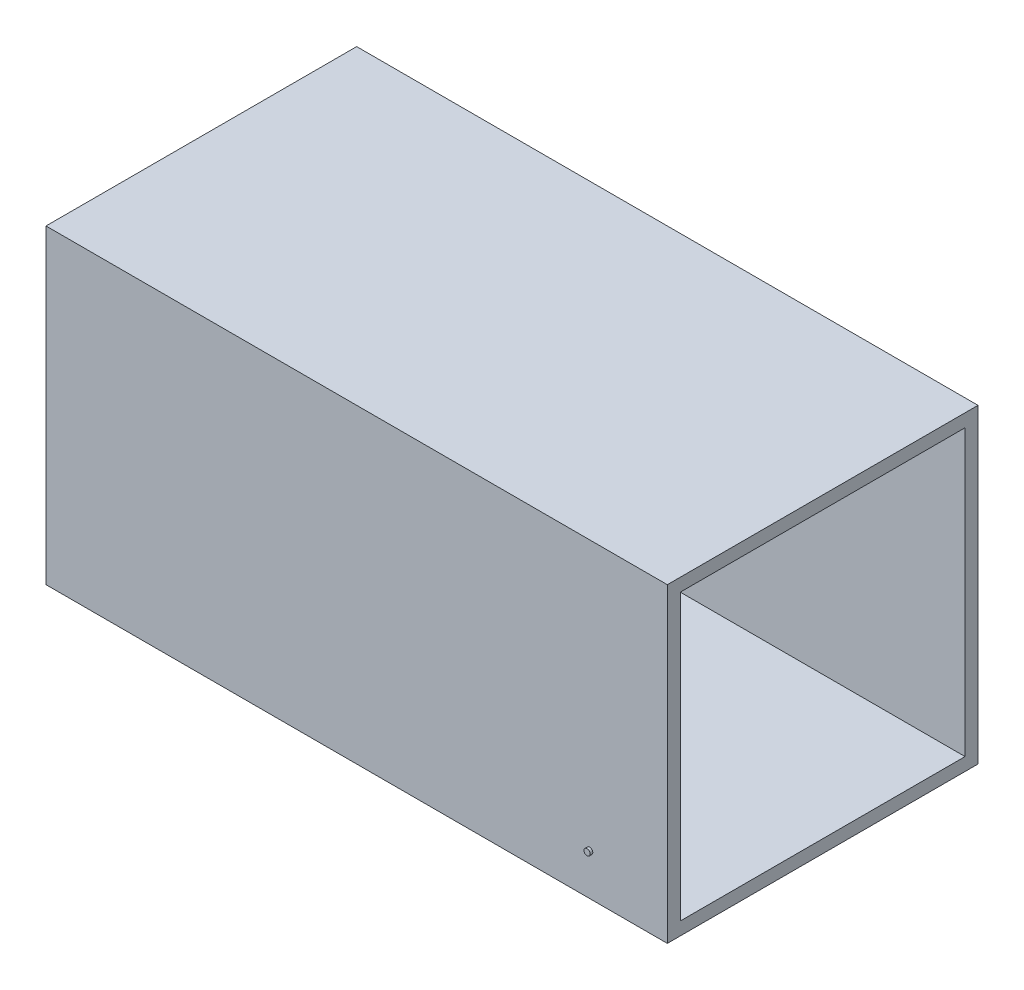
ISO-10303-21;
HEADER;
FILE_DESCRIPTION(('STEP AP214'),'2;1');
FILE_NAME('part.step','',(''),(''),'','','');
FILE_SCHEMA(('AUTOMOTIVE_DESIGN { 1 0 10303 214 1 1 1 1 }'));
ENDSEC;
DATA;
#1=APPLICATION_CONTEXT('core data for automotive mechanical design processes');
#2=APPLICATION_PROTOCOL_DEFINITION('international standard','automotive_design',2000,#1);
#3=PRODUCT_CONTEXT('',#1,'mechanical');
#4=PRODUCT('Part','Part','',(#3));
#5=PRODUCT_RELATED_PRODUCT_CATEGORY('part','',(#4));
#6=PRODUCT_DEFINITION_FORMATION('','',#4);
#7=PRODUCT_DEFINITION_CONTEXT('part definition',#1,'design');
#8=PRODUCT_DEFINITION('design','',#6,#7);
#9=PRODUCT_DEFINITION_SHAPE('','',#8);
#10=(LENGTH_UNIT() NAMED_UNIT(*) SI_UNIT(.MILLI.,.METRE.));
#11=(NAMED_UNIT(*) PLANE_ANGLE_UNIT() SI_UNIT($,.RADIAN.));
#12=(NAMED_UNIT(*) SI_UNIT($,.STERADIAN.) SOLID_ANGLE_UNIT());
#13=UNCERTAINTY_MEASURE_WITH_UNIT(LENGTH_MEASURE(1.E-05),#10,'distance_accuracy_value','');
#14=(GEOMETRIC_REPRESENTATION_CONTEXT(3) GLOBAL_UNCERTAINTY_ASSIGNED_CONTEXT((#13)) GLOBAL_UNIT_ASSIGNED_CONTEXT((#10,
#11,#12)) REPRESENTATION_CONTEXT('',''));
#15=CARTESIAN_POINT('',(0.,0.,0.));
#16=DIRECTION('',(0.,0.,1.));
#17=DIRECTION('',(1.,0.,0.));
#18=AXIS2_PLACEMENT_3D('',#15,#16,#17);
#19=CARTESIAN_POINT('',(1200.,0.,0.));
#20=DIRECTION('',(0.,0.,-1.));
#21=DIRECTION('',(-1.,0.,0.));
#22=AXIS2_PLACEMENT_3D('',#19,#20,#21);
#23=PLANE('',#22);
#24=DIRECTION('',(0.,-1.,0.));
#25=VECTOR('',#24,1.);
#26=CARTESIAN_POINT('',(0.,0.,0.));
#27=LINE('',#26,#25);
#28=CARTESIAN_POINT('',(0.,600.,0.));
#29=VERTEX_POINT('',#28);
#30=CARTESIAN_POINT('',(0.,0.,0.));
#31=VERTEX_POINT('',#30);
#32=EDGE_CURVE('E165',#29,#31,#27,.T.);
#33=ORIENTED_EDGE('',*,*,#32,.T.);
#34=DIRECTION('',(-1.,0.,0.));
#35=VECTOR('',#34,1.);
#36=CARTESIAN_POINT('',(1200.,0.,0.));
#37=LINE('',#36,#35);
#38=CARTESIAN_POINT('',(1200.,0.,0.));
#39=VERTEX_POINT('',#38);
#40=EDGE_CURVE('E46',#39,#31,#37,.T.);
#41=ORIENTED_EDGE('',*,*,#40,.F.);
#42=DIRECTION('',(0.,-1.,0.));
#43=VECTOR('',#42,1.);
#44=CARTESIAN_POINT('',(1200.,0.,0.));
#45=LINE('',#44,#43);
#46=CARTESIAN_POINT('',(1200.,600.,0.));
#47=VERTEX_POINT('',#46);
#48=EDGE_CURVE('E155',#47,#39,#45,.T.);
#49=ORIENTED_EDGE('',*,*,#48,.F.);
#50=DIRECTION('',(-1.,0.,0.));
#51=VECTOR('',#50,1.);
#52=CARTESIAN_POINT('',(1200.,600.,0.));
#53=LINE('',#52,#51);
#54=EDGE_CURVE('E164',#47,#29,#53,.T.);
#55=ORIENTED_EDGE('',*,*,#54,.T.);
#56=EDGE_LOOP('',(#33,#41,#49,#55));
#57=FACE_BOUND('',#56,.T.);
#58=CARTESIAN_POINT('',(1050.,80.,0.));
#59=DIRECTION('',(0.,0.,-1.));
#60=DIRECTION('',(-1.,0.,0.));
#61=AXIS2_PLACEMENT_3D('',#58,#59,#60);
#62=CIRCLE('',#61,6.0000000000001);
#63=CARTESIAN_POINT('',(1044.,80.,0.));
#64=VERTEX_POINT('',#63);
#65=EDGE_CURVE('E11',#64,#64,#62,.F.);
#66=ORIENTED_EDGE('',*,*,#65,.F.);
#67=EDGE_LOOP('',(#66));
#68=FACE_BOUND('',#67,.T.);
#69=ADVANCED_FACE('F39',(#57,#68),#23,.F.);
#70=CARTESIAN_POINT('',(1200.,600.,0.));
#71=DIRECTION('',(-1.,0.,0.));
#72=DIRECTION('',(0.,0.,1.));
#73=AXIS2_PLACEMENT_3D('',#70,#71,#72);
#74=PLANE('',#73);
#75=ORIENTED_EDGE('',*,*,#48,.T.);
#76=DIRECTION('',(0.,0.,-1.));
#77=VECTOR('',#76,1.);
#78=CARTESIAN_POINT('',(1200.,0.,0.));
#79=LINE('',#78,#77);
#80=CARTESIAN_POINT('',(1200.,0.,-600.));
#81=VERTEX_POINT('',#80);
#82=EDGE_CURVE('E91',#39,#81,#79,.T.);
#83=ORIENTED_EDGE('',*,*,#82,.T.);
#84=DIRECTION('',(0.,1.,0.));
#85=VECTOR('',#84,1.);
#86=CARTESIAN_POINT('',(1200.,0.,-600.));
#87=LINE('',#86,#85);
#88=CARTESIAN_POINT('',(1200.,600.,-600.));
#89=VERTEX_POINT('',#88);
#90=EDGE_CURVE('E160',#81,#89,#87,.T.);
#91=ORIENTED_EDGE('',*,*,#90,.T.);
#92=DIRECTION('',(0.,0.,1.));
#93=VECTOR('',#92,1.);
#94=CARTESIAN_POINT('',(1200.,600.,0.));
#95=LINE('',#94,#93);
#96=EDGE_CURVE('E62',#89,#47,#95,.T.);
#97=ORIENTED_EDGE('',*,*,#96,.T.);
#98=EDGE_LOOP('',(#75,#83,#91,#97));
#99=FACE_BOUND('',#98,.T.);
#100=DIRECTION('',(0.,-1.,0.));
#101=VECTOR('',#100,1.);
#102=CARTESIAN_POINT('',(1200.,600.,-25.));
#103=LINE('',#102,#101);
#104=CARTESIAN_POINT('',(1200.,575.,-25.));
#105=VERTEX_POINT('',#104);
#106=CARTESIAN_POINT('',(1200.,25.,-25.));
#107=VERTEX_POINT('',#106);
#108=EDGE_CURVE('E141',#105,#107,#103,.T.);
#109=ORIENTED_EDGE('',*,*,#108,.F.);
#110=DIRECTION('',(0.,0.,1.));
#111=VECTOR('',#110,1.);
#112=CARTESIAN_POINT('',(1200.,575.,0.));
#113=LINE('',#112,#111);
#114=CARTESIAN_POINT('',(1200.,575.,-575.));
#115=VERTEX_POINT('',#114);
#116=EDGE_CURVE('E153',#115,#105,#113,.T.);
#117=ORIENTED_EDGE('',*,*,#116,.F.);
#118=DIRECTION('',(0.,1.,0.));
#119=VECTOR('',#118,1.);
#120=CARTESIAN_POINT('',(1200.,600.,-575.));
#121=LINE('',#120,#119);
#122=CARTESIAN_POINT('',(1200.,25.,-575.));
#123=VERTEX_POINT('',#122);
#124=EDGE_CURVE('E150',#123,#115,#121,.T.);
#125=ORIENTED_EDGE('',*,*,#124,.F.);
#126=DIRECTION('',(0.,0.,-1.));
#127=VECTOR('',#126,1.);
#128=CARTESIAN_POINT('',(1200.,25.,0.));
#129=LINE('',#128,#127);
#130=EDGE_CURVE('E131',#107,#123,#129,.T.);
#131=ORIENTED_EDGE('',*,*,#130,.F.);
#132=EDGE_LOOP('',(#109,#117,#125,#131));
#133=FACE_BOUND('',#132,.T.);
#134=ADVANCED_FACE('F198',(#99,#133),#74,.F.);
#135=CARTESIAN_POINT('',(1200.,0.,0.));
#136=DIRECTION('',(0.,1.,0.));
#137=DIRECTION('',(0.,0.,1.));
#138=AXIS2_PLACEMENT_3D('',#135,#136,#137);
#139=PLANE('',#138);
#140=DIRECTION('',(0.,0.,-1.));
#141=VECTOR('',#140,1.);
#142=CARTESIAN_POINT('',(0.,0.,0.));
#143=LINE('',#142,#141);
#144=CARTESIAN_POINT('',(0.,0.,-600.));
#145=VERTEX_POINT('',#144);
#146=EDGE_CURVE('E168',#31,#145,#143,.T.);
#147=ORIENTED_EDGE('',*,*,#146,.T.);
#148=DIRECTION('',(-1.,0.,0.));
#149=VECTOR('',#148,1.);
#150=CARTESIAN_POINT('',(1200.,0.,-600.));
#151=LINE('',#150,#149);
#152=EDGE_CURVE('E178',#81,#145,#151,.T.);
#153=ORIENTED_EDGE('',*,*,#152,.F.);
#154=ORIENTED_EDGE('',*,*,#82,.F.);
#155=ORIENTED_EDGE('',*,*,#40,.T.);
#156=EDGE_LOOP('',(#147,#153,#154,#155));
#157=FACE_BOUND('',#156,.T.);
#158=ADVANCED_FACE('F185',(#157),#139,.F.);
#159=CARTESIAN_POINT('',(1200.,0.,-600.));
#160=DIRECTION('',(0.,0.,1.));
#161=DIRECTION('',(1.,0.,0.));
#162=AXIS2_PLACEMENT_3D('',#159,#160,#161);
#163=PLANE('',#162);
#164=CARTESIAN_POINT('',(1050.,80.,-600.));
#165=DIRECTION('',(0.,0.,1.));
#166=DIRECTION('',(1.,0.,0.));
#167=AXIS2_PLACEMENT_3D('',#164,#165,#166);
#168=CIRCLE('',#167,6.0000000000001);
#169=CARTESIAN_POINT('',(1056.,80.,-600.));
#170=VERTEX_POINT('',#169);
#171=EDGE_CURVE('E220',#170,#170,#168,.T.);
#172=ORIENTED_EDGE('',*,*,#171,.T.);
#173=EDGE_LOOP('',(#172));
#174=FACE_BOUND('',#173,.T.);
#175=DIRECTION('',(0.,1.,0.));
#176=VECTOR('',#175,1.);
#177=CARTESIAN_POINT('',(0.,0.,-600.));
#178=LINE('',#177,#176);
#179=CARTESIAN_POINT('',(0.,600.,-600.));
#180=VERTEX_POINT('',#179);
#181=EDGE_CURVE('E171',#145,#180,#178,.T.);
#182=ORIENTED_EDGE('',*,*,#181,.T.);
#183=DIRECTION('',(-1.,0.,0.));
#184=VECTOR('',#183,1.);
#185=CARTESIAN_POINT('',(1200.,600.,-600.));
#186=LINE('',#185,#184);
#187=EDGE_CURVE('E176',#89,#180,#186,.T.);
#188=ORIENTED_EDGE('',*,*,#187,.F.);
#189=ORIENTED_EDGE('',*,*,#90,.F.);
#190=ORIENTED_EDGE('',*,*,#152,.T.);
#191=EDGE_LOOP('',(#182,#188,#189,#190));
#192=FACE_BOUND('',#191,.T.);
#193=ADVANCED_FACE('F195',(#174,#192),#163,.F.);
#194=CARTESIAN_POINT('',(1200.,600.,0.));
#195=DIRECTION('',(0.,-1.,0.));
#196=DIRECTION('',(0.,0.,-1.));
#197=AXIS2_PLACEMENT_3D('',#194,#195,#196);
#198=PLANE('',#197);
#199=DIRECTION('',(0.,0.,1.));
#200=VECTOR('',#199,1.);
#201=CARTESIAN_POINT('',(0.,600.,0.));
#202=LINE('',#201,#200);
#203=EDGE_CURVE('E83',#180,#29,#202,.T.);
#204=ORIENTED_EDGE('',*,*,#203,.T.);
#205=ORIENTED_EDGE('',*,*,#54,.F.);
#206=ORIENTED_EDGE('',*,*,#96,.F.);
#207=ORIENTED_EDGE('',*,*,#187,.T.);
#208=EDGE_LOOP('',(#204,#205,#206,#207));
#209=FACE_BOUND('',#208,.T.);
#210=ADVANCED_FACE('F197',(#209),#198,.F.);
#211=CARTESIAN_POINT('',(0.,600.,0.));
#212=DIRECTION('',(-1.,0.,0.));
#213=DIRECTION('',(0.,0.,1.));
#214=AXIS2_PLACEMENT_3D('',#211,#212,#213);
#215=PLANE('',#214);
#216=ORIENTED_EDGE('',*,*,#32,.F.);
#217=ORIENTED_EDGE('',*,*,#203,.F.);
#218=ORIENTED_EDGE('',*,*,#181,.F.);
#219=ORIENTED_EDGE('',*,*,#146,.F.);
#220=EDGE_LOOP('',(#216,#217,#218,#219));
#221=FACE_BOUND('',#220,.T.);
#222=ADVANCED_FACE('F191',(#221),#215,.T.);
#223=CARTESIAN_POINT('',(1200.,0.,-25.));
#224=DIRECTION('',(0.,0.,-1.));
#225=DIRECTION('',(-1.,0.,0.));
#226=AXIS2_PLACEMENT_3D('',#223,#224,#225);
#227=PLANE('',#226);
#228=DIRECTION('',(0.,-1.,0.));
#229=VECTOR('',#228,1.);
#230=CARTESIAN_POINT('',(25.,600.,-25.));
#231=LINE('',#230,#229);
#232=CARTESIAN_POINT('',(25.,575.,-25.));
#233=VERTEX_POINT('',#232);
#234=CARTESIAN_POINT('',(25.,25.,-25.));
#235=VERTEX_POINT('',#234);
#236=EDGE_CURVE('E121',#233,#235,#231,.T.);
#237=ORIENTED_EDGE('',*,*,#236,.F.);
#238=DIRECTION('',(-1.,0.,0.));
#239=VECTOR('',#238,1.);
#240=CARTESIAN_POINT('',(1200.,575.,-25.));
#241=LINE('',#240,#239);
#242=EDGE_CURVE('E144',#105,#233,#241,.T.);
#243=ORIENTED_EDGE('',*,*,#242,.F.);
#244=ORIENTED_EDGE('',*,*,#108,.T.);
#245=DIRECTION('',(-1.,0.,0.));
#246=VECTOR('',#245,1.);
#247=CARTESIAN_POINT('',(1200.,25.,-25.));
#248=LINE('',#247,#246);
#249=EDGE_CURVE('E135',#107,#235,#248,.T.);
#250=ORIENTED_EDGE('',*,*,#249,.T.);
#251=EDGE_LOOP('',(#237,#243,#244,#250));
#252=FACE_BOUND('',#251,.T.);
#253=ADVANCED_FACE('F206',(#252),#227,.T.);
#254=CARTESIAN_POINT('',(1200.,25.,0.));
#255=DIRECTION('',(0.,1.,0.));
#256=DIRECTION('',(0.,0.,1.));
#257=AXIS2_PLACEMENT_3D('',#254,#255,#256);
#258=PLANE('',#257);
#259=DIRECTION('',(0.,0.,-1.));
#260=VECTOR('',#259,1.);
#261=CARTESIAN_POINT('',(25.,25.,0.));
#262=LINE('',#261,#260);
#263=CARTESIAN_POINT('',(25.,25.,-575.));
#264=VERTEX_POINT('',#263);
#265=EDGE_CURVE('E115',#235,#264,#262,.T.);
#266=ORIENTED_EDGE('',*,*,#265,.F.);
#267=ORIENTED_EDGE('',*,*,#249,.F.);
#268=ORIENTED_EDGE('',*,*,#130,.T.);
#269=DIRECTION('',(-1.,0.,0.));
#270=VECTOR('',#269,1.);
#271=CARTESIAN_POINT('',(1200.,25.,-575.));
#272=LINE('',#271,#270);
#273=EDGE_CURVE('E128',#123,#264,#272,.T.);
#274=ORIENTED_EDGE('',*,*,#273,.T.);
#275=EDGE_LOOP('',(#266,#267,#268,#274));
#276=FACE_BOUND('',#275,.T.);
#277=ADVANCED_FACE('F129',(#276),#258,.T.);
#278=CARTESIAN_POINT('',(1200.,0.,-575.));
#279=DIRECTION('',(0.,0.,1.));
#280=DIRECTION('',(1.,0.,0.));
#281=AXIS2_PLACEMENT_3D('',#278,#279,#280);
#282=PLANE('',#281);
#283=DIRECTION('',(0.,1.,0.));
#284=VECTOR('',#283,1.);
#285=CARTESIAN_POINT('',(25.,600.,-575.));
#286=LINE('',#285,#284);
#287=CARTESIAN_POINT('',(25.,575.,-575.));
#288=VERTEX_POINT('',#287);
#289=EDGE_CURVE('E119',#264,#288,#286,.T.);
#290=ORIENTED_EDGE('',*,*,#289,.F.);
#291=ORIENTED_EDGE('',*,*,#273,.F.);
#292=ORIENTED_EDGE('',*,*,#124,.T.);
#293=DIRECTION('',(-1.,0.,0.));
#294=VECTOR('',#293,1.);
#295=CARTESIAN_POINT('',(1200.,575.,-575.));
#296=LINE('',#295,#294);
#297=EDGE_CURVE('E53',#115,#288,#296,.T.);
#298=ORIENTED_EDGE('',*,*,#297,.T.);
#299=EDGE_LOOP('',(#290,#291,#292,#298));
#300=FACE_BOUND('',#299,.T.);
#301=ADVANCED_FACE('F137',(#300),#282,.T.);
#302=CARTESIAN_POINT('',(1200.,575.,0.));
#303=DIRECTION('',(0.,-1.,0.));
#304=DIRECTION('',(0.,0.,-1.));
#305=AXIS2_PLACEMENT_3D('',#302,#303,#304);
#306=PLANE('',#305);
#307=DIRECTION('',(0.,0.,1.));
#308=VECTOR('',#307,1.);
#309=CARTESIAN_POINT('',(25.,575.,0.));
#310=LINE('',#309,#308);
#311=EDGE_CURVE('E138',#288,#233,#310,.T.);
#312=ORIENTED_EDGE('',*,*,#311,.F.);
#313=ORIENTED_EDGE('',*,*,#297,.F.);
#314=ORIENTED_EDGE('',*,*,#116,.T.);
#315=ORIENTED_EDGE('',*,*,#242,.T.);
#316=EDGE_LOOP('',(#312,#313,#314,#315));
#317=FACE_BOUND('',#316,.T.);
#318=ADVANCED_FACE('F212',(#317),#306,.T.);
#319=CARTESIAN_POINT('',(25.,600.,0.));
#320=DIRECTION('',(-1.,0.,0.));
#321=DIRECTION('',(0.,0.,1.));
#322=AXIS2_PLACEMENT_3D('',#319,#320,#321);
#323=PLANE('',#322);
#324=ORIENTED_EDGE('',*,*,#236,.T.);
#325=ORIENTED_EDGE('',*,*,#265,.T.);
#326=ORIENTED_EDGE('',*,*,#289,.T.);
#327=ORIENTED_EDGE('',*,*,#311,.T.);
#328=EDGE_LOOP('',(#324,#325,#326,#327));
#329=FACE_BOUND('',#328,.T.);
#330=ADVANCED_FACE('F117',(#329),#323,.F.);
#331=CARTESIAN_POINT('',(1050.,80.,5.));
#332=DIRECTION('',(0.,0.,-1.));
#333=DIRECTION('',(-1.,0.,0.));
#334=AXIS2_PLACEMENT_3D('',#331,#332,#333);
#335=CYLINDRICAL_SURFACE('',#334,6.0000000000001);
#336=CARTESIAN_POINT('',(1050.,80.,5.));
#337=DIRECTION('',(0.,0.,1.));
#338=DIRECTION('',(1.,0.,0.));
#339=AXIS2_PLACEMENT_3D('',#336,#337,#338);
#340=CIRCLE('',#339,6.0000000000001);
#341=CARTESIAN_POINT('',(1056.,80.,5.));
#342=VERTEX_POINT('',#341);
#343=EDGE_CURVE('E213',#342,#342,#340,.T.);
#344=ORIENTED_EDGE('',*,*,#343,.F.);
#345=EDGE_LOOP('',(#344));
#346=FACE_BOUND('',#345,.T.);
#347=ORIENTED_EDGE('',*,*,#65,.T.);
#348=EDGE_LOOP('',(#347));
#349=FACE_BOUND('',#348,.T.);
#350=ADVANCED_FACE('F239',(#346,#349),#335,.T.);
#351=CARTESIAN_POINT('',(1050.,80.,5.));
#352=DIRECTION('',(0.,0.,1.));
#353=DIRECTION('',(1.,0.,0.));
#354=AXIS2_PLACEMENT_3D('',#351,#352,#353);
#355=PLANE('',#354);
#356=ORIENTED_EDGE('',*,*,#343,.T.);
#357=EDGE_LOOP('',(#356));
#358=FACE_BOUND('',#357,.T.);
#359=ADVANCED_FACE('F230',(#358),#355,.T.);
#360=CARTESIAN_POINT('',(1050.,80.,-605.));
#361=DIRECTION('',(0.,0.,1.));
#362=DIRECTION('',(1.,0.,0.));
#363=AXIS2_PLACEMENT_3D('',#360,#361,#362);
#364=CYLINDRICAL_SURFACE('',#363,6.0000000000001);
#365=CARTESIAN_POINT('',(1050.,80.,-605.));
#366=DIRECTION('',(0.,0.,1.));
#367=DIRECTION('',(1.,0.,0.));
#368=AXIS2_PLACEMENT_3D('',#365,#366,#367);
#369=CIRCLE('',#368,6.0000000000001);
#370=CARTESIAN_POINT('',(1056.,80.,-605.));
#371=VERTEX_POINT('',#370);
#372=EDGE_CURVE('E215',#371,#371,#369,.T.);
#373=ORIENTED_EDGE('',*,*,#372,.T.);
#374=EDGE_LOOP('',(#373));
#375=FACE_BOUND('',#374,.T.);
#376=ORIENTED_EDGE('',*,*,#171,.F.);
#377=EDGE_LOOP('',(#376));
#378=FACE_BOUND('',#377,.T.);
#379=ADVANCED_FACE('F227',(#375,#378),#364,.T.);
#380=CARTESIAN_POINT('',(1050.,80.,-605.));
#381=DIRECTION('',(0.,0.,-1.));
#382=DIRECTION('',(1.,0.,0.));
#383=AXIS2_PLACEMENT_3D('',#380,#381,#382);
#384=PLANE('',#383);
#385=ORIENTED_EDGE('',*,*,#372,.F.);
#386=EDGE_LOOP('',(#385));
#387=FACE_BOUND('',#386,.T.);
#388=ADVANCED_FACE('F229',(#387),#384,.T.);
#389=CLOSED_SHELL('',(#69,#134,#158,#193,#210,#222,#253,#277,#301,#318,#330,#350,#359,#379,#388));
#390=MANIFOLD_SOLID_BREP('B2',#389);
#391=ADVANCED_BREP_SHAPE_REPRESENTATION('',(#18,#390),#14);
#392=SHAPE_DEFINITION_REPRESENTATION(#9,#391);
ENDSEC;
END-ISO-10303-21;
